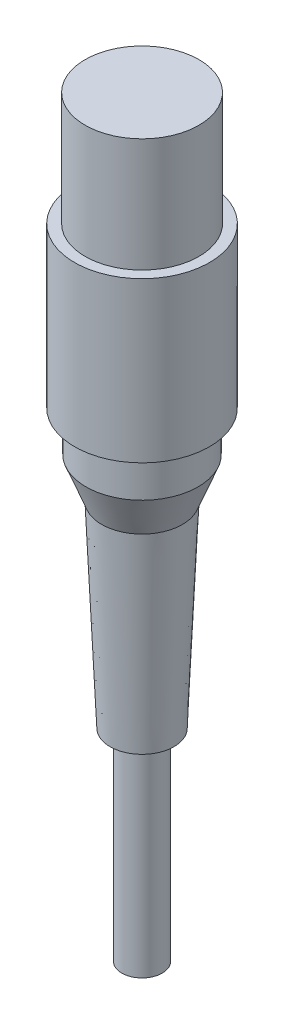
ISO-10303-21;
HEADER;
FILE_DESCRIPTION(('STEP AP214'),'2;1');
FILE_NAME('part.step','',(''),(''),'','','');
FILE_SCHEMA(('AUTOMOTIVE_DESIGN { 1 0 10303 214 1 1 1 1 }'));
ENDSEC;
DATA;
#1=APPLICATION_CONTEXT('core data for automotive mechanical design processes');
#2=APPLICATION_PROTOCOL_DEFINITION('international standard','automotive_design',2000,#1);
#3=PRODUCT_CONTEXT('',#1,'mechanical');
#4=PRODUCT('Part','Part','',(#3));
#5=PRODUCT_RELATED_PRODUCT_CATEGORY('part','',(#4));
#6=PRODUCT_DEFINITION_FORMATION('','',#4);
#7=PRODUCT_DEFINITION_CONTEXT('part definition',#1,'design');
#8=PRODUCT_DEFINITION('design','',#6,#7);
#9=PRODUCT_DEFINITION_SHAPE('','',#8);
#10=(LENGTH_UNIT() NAMED_UNIT(*) SI_UNIT(.MILLI.,.METRE.));
#11=(NAMED_UNIT(*) PLANE_ANGLE_UNIT() SI_UNIT($,.RADIAN.));
#12=(NAMED_UNIT(*) SI_UNIT($,.STERADIAN.) SOLID_ANGLE_UNIT());
#13=UNCERTAINTY_MEASURE_WITH_UNIT(LENGTH_MEASURE(1.E-05),#10,'distance_accuracy_value','');
#14=(GEOMETRIC_REPRESENTATION_CONTEXT(3) GLOBAL_UNCERTAINTY_ASSIGNED_CONTEXT((#13)) GLOBAL_UNIT_ASSIGNED_CONTEXT((#10,
#11,#12)) REPRESENTATION_CONTEXT('',''));
#15=CARTESIAN_POINT('',(0.,0.,0.));
#16=DIRECTION('',(0.,0.,1.));
#17=DIRECTION('',(1.,0.,0.));
#18=AXIS2_PLACEMENT_3D('',#15,#16,#17);
#19=CARTESIAN_POINT('',(0.,41.21,0.));
#20=DIRECTION('',(0.,1.,0.));
#21=DIRECTION('',(0.,0.,1.));
#22=AXIS2_PLACEMENT_3D('',#19,#20,#21);
#23=PLANE('',#22);
#24=CARTESIAN_POINT('',(0.,41.21,0.));
#25=DIRECTION('',(0.,-1.,0.));
#26=DIRECTION('',(0.,0.,-1.));
#27=AXIS2_PLACEMENT_3D('',#24,#25,#26);
#28=CIRCLE('',#27,8.33);
#29=CARTESIAN_POINT('',(0.,41.21,-8.33));
#30=VERTEX_POINT('',#29);
#31=EDGE_CURVE('E39',#30,#30,#28,.T.);
#32=ORIENTED_EDGE('',*,*,#31,.F.);
#33=EDGE_LOOP('',(#32));
#34=FACE_BOUND('',#33,.T.);
#35=CARTESIAN_POINT('',(0.,41.21,0.));
#36=DIRECTION('',(0.,-1.,0.));
#37=DIRECTION('',(0.,0.,-1.));
#38=AXIS2_PLACEMENT_3D('',#35,#36,#37);
#39=CIRCLE('',#38,10.015);
#40=CARTESIAN_POINT('',(0.,41.21,-10.015));
#41=VERTEX_POINT('',#40);
#42=EDGE_CURVE('E35',#41,#41,#39,.T.);
#43=ORIENTED_EDGE('',*,*,#42,.T.);
#44=EDGE_LOOP('',(#43));
#45=FACE_BOUND('',#44,.T.);
#46=ADVANCED_FACE('F32',(#34,#45),#23,.F.);
#47=CARTESIAN_POINT('',(0.,0.,0.));
#48=DIRECTION('',(0.,-1.,0.));
#49=DIRECTION('',(0.,0.,-1.));
#50=AXIS2_PLACEMENT_3D('',#47,#48,#49);
#51=CYLINDRICAL_SURFACE('',#50,10.015);
#52=ORIENTED_EDGE('',*,*,#42,.F.);
#53=EDGE_LOOP('',(#52));
#54=FACE_BOUND('',#53,.T.);
#55=CARTESIAN_POINT('',(0.,64.9,0.));
#56=DIRECTION('',(0.,-1.,0.));
#57=DIRECTION('',(0.,0.,-1.));
#58=AXIS2_PLACEMENT_3D('',#55,#56,#57);
#59=CIRCLE('',#58,10.015);
#60=CARTESIAN_POINT('',(0.,64.9,-10.015));
#61=VERTEX_POINT('',#60);
#62=EDGE_CURVE('E62',#61,#61,#59,.T.);
#63=ORIENTED_EDGE('',*,*,#62,.T.);
#64=EDGE_LOOP('',(#63));
#65=FACE_BOUND('',#64,.T.);
#66=ADVANCED_FACE('F70',(#54,#65),#51,.T.);
#67=CARTESIAN_POINT('',(0.,64.9,0.));
#68=DIRECTION('',(0.,-1.,0.));
#69=DIRECTION('',(0.,0.,-1.));
#70=AXIS2_PLACEMENT_3D('',#67,#68,#69);
#71=PLANE('',#70);
#72=ORIENTED_EDGE('',*,*,#62,.F.);
#73=EDGE_LOOP('',(#72));
#74=FACE_BOUND('',#73,.T.);
#75=CARTESIAN_POINT('',(0.,64.9,0.));
#76=DIRECTION('',(0.,-1.,0.));
#77=DIRECTION('',(0.,0.,-1.));
#78=AXIS2_PLACEMENT_3D('',#75,#76,#77);
#79=CIRCLE('',#78,8.45);
#80=CARTESIAN_POINT('',(0.,64.9,-8.45));
#81=VERTEX_POINT('',#80);
#82=EDGE_CURVE('E60',#81,#81,#79,.T.);
#83=ORIENTED_EDGE('',*,*,#82,.T.);
#84=EDGE_LOOP('',(#83));
#85=FACE_BOUND('',#84,.T.);
#86=ADVANCED_FACE('F72',(#74,#85),#71,.F.);
#87=CARTESIAN_POINT('',(0.,0.,0.));
#88=DIRECTION('',(0.,-1.,0.));
#89=DIRECTION('',(0.,0.,-1.));
#90=AXIS2_PLACEMENT_3D('',#87,#88,#89);
#91=CYLINDRICAL_SURFACE('',#90,8.45);
#92=ORIENTED_EDGE('',*,*,#82,.F.);
#93=EDGE_LOOP('',(#92));
#94=FACE_BOUND('',#93,.T.);
#95=CARTESIAN_POINT('',(0.,81.78,0.));
#96=DIRECTION('',(0.,-1.,0.));
#97=DIRECTION('',(0.,0.,-1.));
#98=AXIS2_PLACEMENT_3D('',#95,#96,#97);
#99=CIRCLE('',#98,8.45);
#100=CARTESIAN_POINT('',(0.,81.78,-8.45));
#101=VERTEX_POINT('',#100);
#102=EDGE_CURVE('E56',#101,#101,#99,.T.);
#103=ORIENTED_EDGE('',*,*,#102,.T.);
#104=EDGE_LOOP('',(#103));
#105=FACE_BOUND('',#104,.T.);
#106=ADVANCED_FACE('F77',(#94,#105),#91,.T.);
#107=CARTESIAN_POINT('',(0.,81.78,0.));
#108=DIRECTION('',(0.,-1.,0.));
#109=DIRECTION('',(0.,0.,-1.));
#110=AXIS2_PLACEMENT_3D('',#107,#108,#109);
#111=PLANE('',#110);
#112=ORIENTED_EDGE('',*,*,#102,.F.);
#113=EDGE_LOOP('',(#112));
#114=FACE_BOUND('',#113,.T.);
#115=ADVANCED_FACE('F84',(#114),#111,.F.);
#116=CARTESIAN_POINT('',(0.,0.,0.));
#117=DIRECTION('',(0.,-1.,0.));
#118=DIRECTION('',(0.,0.,-1.));
#119=AXIS2_PLACEMENT_3D('',#116,#117,#118);
#120=CYLINDRICAL_SURFACE('',#119,8.33);
#121=CARTESIAN_POINT('',(0.,35.21,0.));
#122=DIRECTION('',(0.,-1.,0.));
#123=DIRECTION('',(0.,0.,-1.));
#124=AXIS2_PLACEMENT_3D('',#121,#122,#123);
#125=CIRCLE('',#124,8.33);
#126=CARTESIAN_POINT('',(0.,35.21,-8.33));
#127=VERTEX_POINT('',#126);
#128=EDGE_CURVE('E48',#127,#127,#125,.T.);
#129=ORIENTED_EDGE('',*,*,#128,.F.);
#130=EDGE_LOOP('',(#129));
#131=FACE_BOUND('',#130,.T.);
#132=ORIENTED_EDGE('',*,*,#31,.T.);
#133=EDGE_LOOP('',(#132));
#134=FACE_BOUND('',#133,.T.);
#135=ADVANCED_FACE('F88',(#131,#134),#120,.T.);
#136=CARTESIAN_POINT('',(0.,0.,0.));
#137=DIRECTION('',(0.,1.,0.));
#138=DIRECTION('',(0.,0.,1.));
#139=AXIS2_PLACEMENT_3D('',#136,#137,#138);
#140=PLANE('',#139);
#141=CARTESIAN_POINT('',(0.,0.,0.));
#142=DIRECTION('',(0.,-1.,0.));
#143=DIRECTION('',(0.,0.,-1.));
#144=AXIS2_PLACEMENT_3D('',#141,#142,#143);
#145=CIRCLE('',#144,3.);
#146=CARTESIAN_POINT('',(0.,0.,-3.));
#147=VERTEX_POINT('',#146);
#148=EDGE_CURVE('E10',#147,#147,#145,.T.);
#149=ORIENTED_EDGE('',*,*,#148,.F.);
#150=EDGE_LOOP('',(#149));
#151=FACE_BOUND('',#150,.T.);
#152=CARTESIAN_POINT('',(0.,0.,0.));
#153=DIRECTION('',(0.,-1.,0.));
#154=DIRECTION('',(0.,0.,-1.));
#155=AXIS2_PLACEMENT_3D('',#152,#153,#154);
#156=CIRCLE('',#155,4.75);
#157=CARTESIAN_POINT('',(0.,0.,-4.75));
#158=VERTEX_POINT('',#157);
#159=EDGE_CURVE('E54',#158,#158,#156,.T.);
#160=ORIENTED_EDGE('',*,*,#159,.T.);
#161=EDGE_LOOP('',(#160));
#162=FACE_BOUND('',#161,.T.);
#163=ADVANCED_FACE('F92',(#151,#162),#140,.F.);
#164=CARTESIAN_POINT('',(0.,29.21,0.));
#165=DIRECTION('',(0.,1.,0.));
#166=DIRECTION('',(0.,0.,1.));
#167=AXIS2_PLACEMENT_3D('',#164,#165,#166);
#168=CONICAL_SURFACE('',#167,6.,0.0427674700507355);
#169=ORIENTED_EDGE('',*,*,#159,.F.);
#170=EDGE_LOOP('',(#169));
#171=FACE_BOUND('',#170,.T.);
#172=CARTESIAN_POINT('',(0.,29.21,0.));
#173=DIRECTION('',(0.,-1.,0.));
#174=DIRECTION('',(0.,0.,-1.));
#175=AXIS2_PLACEMENT_3D('',#172,#173,#174);
#176=CIRCLE('',#175,6.);
#177=CARTESIAN_POINT('',(0.,29.21,-6.));
#178=VERTEX_POINT('',#177);
#179=EDGE_CURVE('E51',#178,#178,#176,.T.);
#180=ORIENTED_EDGE('',*,*,#179,.T.);
#181=EDGE_LOOP('',(#180));
#182=FACE_BOUND('',#181,.T.);
#183=ADVANCED_FACE('F96',(#171,#182),#168,.T.);
#184=CARTESIAN_POINT('',(0.,35.21,0.));
#185=DIRECTION('',(0.,1.,0.));
#186=DIRECTION('',(0.,0.,1.));
#187=AXIS2_PLACEMENT_3D('',#184,#185,#186);
#188=CONICAL_SURFACE('',#187,8.33,0.370408624543169);
#189=ORIENTED_EDGE('',*,*,#179,.F.);
#190=EDGE_LOOP('',(#189));
#191=FACE_BOUND('',#190,.T.);
#192=ORIENTED_EDGE('',*,*,#128,.T.);
#193=EDGE_LOOP('',(#192));
#194=FACE_BOUND('',#193,.T.);
#195=ADVANCED_FACE('F100',(#191,#194),#188,.T.);
#196=CARTESIAN_POINT('',(0.,-30.,0.));
#197=DIRECTION('',(0.,1.,0.));
#198=DIRECTION('',(0.,0.,1.));
#199=AXIS2_PLACEMENT_3D('',#196,#197,#198);
#200=CYLINDRICAL_SURFACE('',#199,3.);
#201=CARTESIAN_POINT('',(0.,-30.,0.));
#202=DIRECTION('',(0.,-1.,0.));
#203=DIRECTION('',(0.,0.,-1.));
#204=AXIS2_PLACEMENT_3D('',#201,#202,#203);
#205=CIRCLE('',#204,3.);
#206=CARTESIAN_POINT('',(0.,-30.,-3.));
#207=VERTEX_POINT('',#206);
#208=EDGE_CURVE('E47',#207,#207,#205,.T.);
#209=ORIENTED_EDGE('',*,*,#208,.F.);
#210=EDGE_LOOP('',(#209));
#211=FACE_BOUND('',#210,.T.);
#212=ORIENTED_EDGE('',*,*,#148,.T.);
#213=EDGE_LOOP('',(#212));
#214=FACE_BOUND('',#213,.T.);
#215=ADVANCED_FACE('F104',(#211,#214),#200,.T.);
#216=CARTESIAN_POINT('',(0.,-30.,0.));
#217=DIRECTION('',(0.,-1.,0.));
#218=DIRECTION('',(0.,0.,-1.));
#219=AXIS2_PLACEMENT_3D('',#216,#217,#218);
#220=PLANE('',#219);
#221=ORIENTED_EDGE('',*,*,#208,.T.);
#222=EDGE_LOOP('',(#221));
#223=FACE_BOUND('',#222,.T.);
#224=ADVANCED_FACE('F108',(#223),#220,.T.);
#225=CLOSED_SHELL('',(#46,#66,#86,#106,#115,#135,#163,#183,#195,#215,#224));
#226=MANIFOLD_SOLID_BREP('B2',#225);
#227=ADVANCED_BREP_SHAPE_REPRESENTATION('',(#18,#226),#14);
#228=SHAPE_DEFINITION_REPRESENTATION(#9,#227);
ENDSEC;
END-ISO-10303-21;
